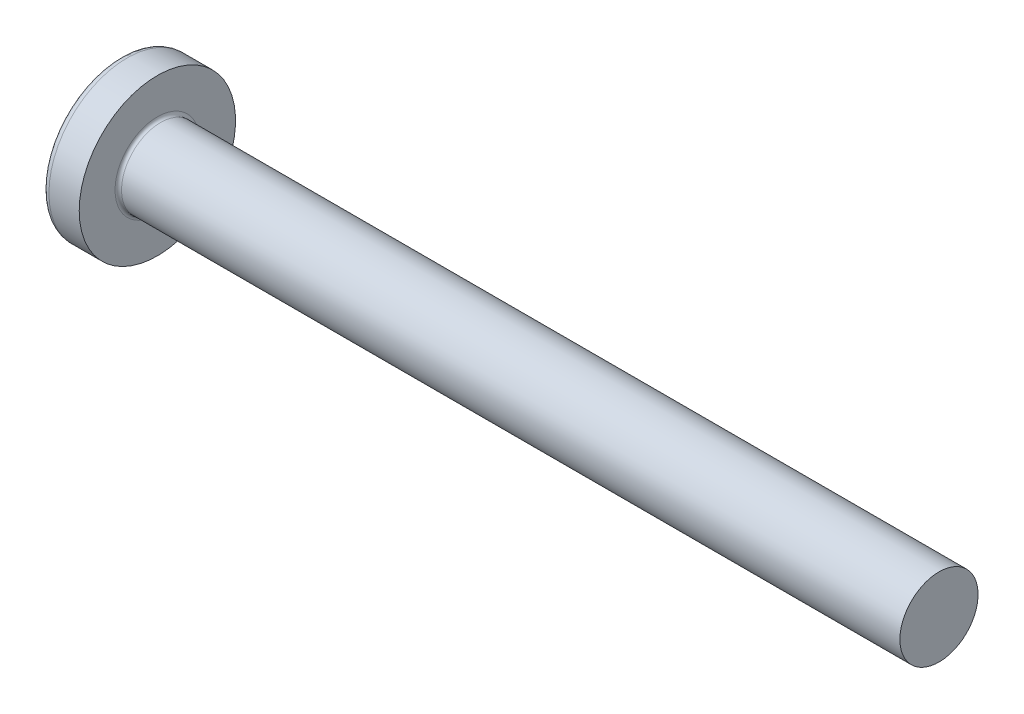
ISO-10303-21;
HEADER;
FILE_DESCRIPTION(('STEP AP214'),'2;1');
FILE_NAME('part.step','',(''),(''),'','','');
FILE_SCHEMA(('AUTOMOTIVE_DESIGN { 1 0 10303 214 1 1 1 1 }'));
ENDSEC;
DATA;
#1=APPLICATION_CONTEXT('core data for automotive mechanical design processes');
#2=APPLICATION_PROTOCOL_DEFINITION('international standard','automotive_design',2000,#1);
#3=PRODUCT_CONTEXT('',#1,'mechanical');
#4=PRODUCT('Part','Part','',(#3));
#5=PRODUCT_RELATED_PRODUCT_CATEGORY('part','',(#4));
#6=PRODUCT_DEFINITION_FORMATION('','',#4);
#7=PRODUCT_DEFINITION_CONTEXT('part definition',#1,'design');
#8=PRODUCT_DEFINITION('design','',#6,#7);
#9=PRODUCT_DEFINITION_SHAPE('','',#8);
#10=(LENGTH_UNIT() NAMED_UNIT(*) SI_UNIT(.MILLI.,.METRE.));
#11=(NAMED_UNIT(*) PLANE_ANGLE_UNIT() SI_UNIT($,.RADIAN.));
#12=(NAMED_UNIT(*) SI_UNIT($,.STERADIAN.) SOLID_ANGLE_UNIT());
#13=UNCERTAINTY_MEASURE_WITH_UNIT(LENGTH_MEASURE(1.E-05),#10,'distance_accuracy_value','');
#14=(GEOMETRIC_REPRESENTATION_CONTEXT(3) GLOBAL_UNCERTAINTY_ASSIGNED_CONTEXT((#13)) GLOBAL_UNIT_ASSIGNED_CONTEXT((#10,
#11,#12)) REPRESENTATION_CONTEXT('',''));
#15=CARTESIAN_POINT('',(0.,0.,0.));
#16=DIRECTION('',(0.,0.,1.));
#17=DIRECTION('',(1.,0.,0.));
#18=AXIS2_PLACEMENT_3D('',#15,#16,#17);
#19=CARTESIAN_POINT('',(10.,0.,0.));
#20=DIRECTION('',(-1.,0.,0.));
#21=DIRECTION('',(0.,1.,0.));
#22=AXIS2_PLACEMENT_3D('',#19,#20,#21);
#23=SPHERICAL_SURFACE('',#22,10.);
#24=CARTESIAN_POINT('',(1.83373872480847,0.,0.));
#25=DIRECTION('',(-1.,0.,0.));
#26=DIRECTION('',(0.,0.,1.));
#27=AXIS2_PLACEMENT_3D('',#24,#25,#26);
#28=CIRCLE('',#27,5.77167019027484);
#29=CARTESIAN_POINT('',(1.83373872480847,0.,5.77167019027484));
#30=VERTEX_POINT('',#29);
#31=EDGE_CURVE('E213',#30,#30,#28,.T.);
#32=ORIENTED_EDGE('',*,*,#31,.T.);
#33=EDGE_LOOP('',(#32));
#34=FACE_BOUND('',#33,.T.);
#35=CARTESIAN_POINT('',(0.11533271177369,0.,0.));
#36=DIRECTION('',(1.,0.,0.));
#37=DIRECTION('',(0.,0.,-1.));
#38=AXIS2_PLACEMENT_3D('',#35,#36,#37);
#39=CIRCLE('',#38,1.51438192047739);
#40=CARTESIAN_POINT('',(0.115332711773695,-0.709999999999995,-1.33762947076864));
#41=VERTEX_POINT('',#40);
#42=CARTESIAN_POINT('',(0.11533271177369,-1.33762947076862,-0.71));
#43=VERTEX_POINT('',#42);
#44=EDGE_CURVE('E339',#41,#43,#39,.F.);
#45=ORIENTED_EDGE('',*,*,#44,.F.);
#46=CARTESIAN_POINT('',(10.,-0.71,0.));
#47=DIRECTION('',(0.,1.,0.));
#48=DIRECTION('',(0.,0.,1.));
#49=AXIS2_PLACEMENT_3D('',#46,#47,#48);
#50=CIRCLE('',#49,9.97476315508293);
#51=CARTESIAN_POINT('',(0.516695966128057,-0.709999999999988,-3.09238493741451));
#52=VERTEX_POINT('',#51);
#53=EDGE_CURVE('E273',#52,#41,#50,.T.);
#54=ORIENTED_EDGE('',*,*,#53,.F.);
#55=CARTESIAN_POINT('',(9.3467899937754,0.,1.3101368059126));
#56=DIRECTION('',(0.446197753347436,0.,-0.894934391398443));
#57=DIRECTION('',(-0.894934391398442,0.,-0.446197753347436));
#58=AXIS2_PLACEMENT_3D('',#55,#56,#57);
#59=CIRCLE('',#58,9.89226254390578);
#60=CARTESIAN_POINT('',(0.516695966128057,0.710000000000011,-3.0923849374145));
#61=VERTEX_POINT('',#60);
#62=EDGE_CURVE('E247',#52,#61,#59,.T.);
#63=ORIENTED_EDGE('',*,*,#62,.T.);
#64=CARTESIAN_POINT('',(10.,0.71,0.));
#65=DIRECTION('',(0.,-1.,0.));
#66=DIRECTION('',(0.,0.,-1.));
#67=AXIS2_PLACEMENT_3D('',#64,#65,#66);
#68=CIRCLE('',#67,9.97476315508293);
#69=CARTESIAN_POINT('',(0.115332711773694,0.710000000000005,-1.33762947076863));
#70=VERTEX_POINT('',#69);
#71=EDGE_CURVE('E301',#70,#61,#68,.T.);
#72=ORIENTED_EDGE('',*,*,#71,.F.);
#73=CARTESIAN_POINT('',(0.11533271177369,1.33762947076862,-0.71));
#74=VERTEX_POINT('',#73);
#75=EDGE_CURVE('E354',#74,#70,#39,.F.);
#76=ORIENTED_EDGE('',*,*,#75,.F.);
#77=CARTESIAN_POINT('',(10.,0.,-0.71));
#78=DIRECTION('',(0.,0.,1.));
#79=DIRECTION('',(0.,-1.,0.));
#80=AXIS2_PLACEMENT_3D('',#77,#78,#79);
#81=CIRCLE('',#80,9.97476315508293);
#82=CARTESIAN_POINT('',(0.516695966128057,3.09238493741451,-0.71));
#83=VERTEX_POINT('',#82);
#84=EDGE_CURVE('E241',#83,#74,#81,.T.);
#85=ORIENTED_EDGE('',*,*,#84,.F.);
#86=CARTESIAN_POINT('',(9.3467899937754,-1.3101368059126,0.));
#87=DIRECTION('',(0.446197753347436,0.894934391398443,0.));
#88=DIRECTION('',(-0.894934391398443,0.446197753347436,0.));
#89=AXIS2_PLACEMENT_3D('',#86,#87,#88);
#90=CIRCLE('',#89,9.89226254390578);
#91=CARTESIAN_POINT('',(0.516695966128057,3.09238493741451,0.71));
#92=VERTEX_POINT('',#91);
#93=EDGE_CURVE('E244',#83,#92,#90,.T.);
#94=ORIENTED_EDGE('',*,*,#93,.T.);
#95=CARTESIAN_POINT('',(10.,0.,0.71));
#96=DIRECTION('',(0.,0.,-1.));
#97=DIRECTION('',(0.,1.,0.));
#98=AXIS2_PLACEMENT_3D('',#95,#96,#97);
#99=CIRCLE('',#98,9.97476315508293);
#100=CARTESIAN_POINT('',(0.11533271177369,1.33762947076862,0.71));
#101=VERTEX_POINT('',#100);
#102=EDGE_CURVE('E237',#101,#92,#99,.T.);
#103=ORIENTED_EDGE('',*,*,#102,.F.);
#104=CARTESIAN_POINT('',(0.115332711773695,0.709999999999995,1.33762947076864));
#105=VERTEX_POINT('',#104);
#106=EDGE_CURVE('E353',#105,#101,#39,.F.);
#107=ORIENTED_EDGE('',*,*,#106,.F.);
#108=CARTESIAN_POINT('',(0.516695966128057,0.709999999999989,3.09238493741451));
#109=VERTEX_POINT('',#108);
#110=EDGE_CURVE('E257',#109,#105,#68,.T.);
#111=ORIENTED_EDGE('',*,*,#110,.F.);
#112=CARTESIAN_POINT('',(9.3467899937754,0.,-1.3101368059126));
#113=DIRECTION('',(0.446197753347436,0.,0.894934391398443));
#114=DIRECTION('',(0.894934391398443,0.,-0.446197753347436));
#115=AXIS2_PLACEMENT_3D('',#112,#113,#114);
#116=CIRCLE('',#115,9.89226254390578);
#117=CARTESIAN_POINT('',(0.516695966128057,-0.710000000000011,3.0923849374145));
#118=VERTEX_POINT('',#117);
#119=EDGE_CURVE('E48',#109,#118,#116,.T.);
#120=ORIENTED_EDGE('',*,*,#119,.T.);
#121=CARTESIAN_POINT('',(0.115332711773695,-0.710000000000005,1.33762947076863));
#122=VERTEX_POINT('',#121);
#123=EDGE_CURVE('E254',#122,#118,#50,.T.);
#124=ORIENTED_EDGE('',*,*,#123,.F.);
#125=CARTESIAN_POINT('',(0.11533271177369,-1.33762947076862,0.709999999999999));
#126=VERTEX_POINT('',#125);
#127=EDGE_CURVE('E385',#126,#122,#39,.F.);
#128=ORIENTED_EDGE('',*,*,#127,.F.);
#129=CARTESIAN_POINT('',(0.516695966128057,-3.0923849374145,0.709999999999999));
#130=VERTEX_POINT('',#129);
#131=EDGE_CURVE('E238',#130,#126,#99,.T.);
#132=ORIENTED_EDGE('',*,*,#131,.F.);
#133=CARTESIAN_POINT('',(9.3467899937754,1.3101368059126,0.));
#134=DIRECTION('',(0.446197753347436,-0.894934391398443,0.));
#135=DIRECTION('',(0.894934391398442,0.446197753347436,0.));
#136=AXIS2_PLACEMENT_3D('',#133,#134,#135);
#137=CIRCLE('',#136,9.89226254390578);
#138=CARTESIAN_POINT('',(0.516695966128057,-3.0923849374145,-0.71));
#139=VERTEX_POINT('',#138);
#140=EDGE_CURVE('E234',#130,#139,#137,.T.);
#141=ORIENTED_EDGE('',*,*,#140,.T.);
#142=EDGE_CURVE('E63',#43,#139,#81,.T.);
#143=ORIENTED_EDGE('',*,*,#142,.F.);
#144=EDGE_LOOP('',(#45,#54,#63,#72,#76,#85,#94,#103,#107,#111,#120,#124,#128,#132,#141,#143));
#145=FACE_BOUND('',#144,.T.);
#146=ADVANCED_FACE('F35',(#34,#145),#23,.T.);
#147=CARTESIAN_POINT('',(3.46,1.62490792462486,-0.71));
#148=DIRECTION('',(0.,0.,1.));
#149=DIRECTION('',(0.,-1.,0.));
#150=AXIS2_PLACEMENT_3D('',#147,#148,#149);
#151=PLANE('',#150);
#152=ORIENTED_EDGE('',*,*,#84,.T.);
#153=CARTESIAN_POINT('',(-2.28089704213722,1.52473965101837,-0.71));
#154=CARTESIAN_POINT('',(-1.81861622822998,1.48907386498352,-0.71));
#155=CARTESIAN_POINT('',(-1.35635131302274,1.45320000395987,-0.71));
#156=CARTESIAN_POINT('',(-0.431857761667543,1.3808964085712,-0.71));
#157=CARTESIAN_POINT('',(0.0303708738054363,1.34446666558133,-0.71));
#158=CARTESIAN_POINT('',(0.954772750089382,1.27091270389059,-0.71));
#159=CARTESIAN_POINT('',(1.41694599093296,1.23378848560061,-0.71));
#160=CARTESIAN_POINT('',(2.1101468655661,1.17741958304234,-0.71));
#161=CARTESIAN_POINT('',(2.34120225142472,1.15851633138213,-0.71));
#162=CARTESIAN_POINT('',(2.80329254149198,1.12044387603508,-0.71));
#163=CARTESIAN_POINT('',(3.03432744556048,1.10127467065167,-0.71));
#164=CARTESIAN_POINT('',(3.81376951672291,1.03608826026628,-0.71));
#165=CARTESIAN_POINT('',(4.3621185642133,0.989367924506424,-0.71));
#166=CARTESIAN_POINT('',(5.18446393534975,0.917336183170652,-0.71));
#167=CARTESIAN_POINT('',(5.45854573527601,0.893000731200899,-0.71));
#168=CARTESIAN_POINT('',(6.00663594033703,0.843493254998865,-0.71));
#169=CARTESIAN_POINT('',(6.28064434495887,0.818321225066341,-0.71));
#170=CARTESIAN_POINT('',(6.82859287274618,0.766879824151132,-0.71));
#171=CARTESIAN_POINT('',(7.10253298312854,0.740610316661091,-0.71));
#172=CARTESIAN_POINT('',(7.65026285025565,0.686585019837831,-0.71));
#173=CARTESIAN_POINT('',(7.92405260972714,0.658829258423122,-0.71));
#174=CARTESIAN_POINT('',(8.33458184018721,0.615573696383426,-0.71));
#175=CARTESIAN_POINT('',(8.4714065534312,0.600884001267348,-0.71));
#176=CARTESIAN_POINT('',(8.74498055470476,0.570826220799602,-0.71));
#177=CARTESIAN_POINT('',(8.88172984329827,0.555458140591717,-0.71));
#178=CARTESIAN_POINT('',(9.15513948220117,0.523868434617907,-0.71));
#179=CARTESIAN_POINT('',(9.29179982631774,0.507646754763106,-0.71));
#180=CARTESIAN_POINT('',(9.56498051884117,0.474039680066355,-0.71));
#181=CARTESIAN_POINT('',(9.70150086350508,0.456654254894289,-0.71));
#182=CARTESIAN_POINT('',(9.83792645731126,0.438531836217976,-0.71));
#183=B_SPLINE_CURVE_WITH_KNOTS('',3,(#153,#154,#155,#156,#157,#158,#159,#160,#161,#162,#163,
#164,#165,#166,#167,#168,#169,#170,#171,#172,#173,#174,#175,#176,#177,#178,#179,#180,#181,#182),
.UNSPECIFIED.,.F.,.F.,(4,2,2,2,2,2,2,2,2,2,2,2,2,2,4),(0.,1.39096401174475,2.78194962715189,
4.17293441960638,4.86841633218882,5.56390268344286,7.21490482310267,8.04038405799492,
8.86586891866053,9.69145676295231,10.5170291044415,10.9298607906012,11.3426893470464,
11.7555440942062,12.1684096055867),.UNSPECIFIED.);
#184=CARTESIAN_POINT('',(3.46,1.06563607765503,-0.710000000000001));
#185=VERTEX_POINT('',#184);
#186=EDGE_CURVE('E374',#74,#185,#183,.T.);
#187=ORIENTED_EDGE('',*,*,#186,.T.);
#188=DIRECTION('',(0.,1.,0.));
#189=VECTOR('',#188,1.);
#190=CARTESIAN_POINT('',(3.46,-1.62490792462486,-0.71));
#191=LINE('',#190,#189);
#192=CARTESIAN_POINT('',(3.46,1.62490792462486,-0.71));
#193=VERTEX_POINT('',#192);
#194=EDGE_CURVE('E322',#185,#193,#191,.T.);
#195=ORIENTED_EDGE('',*,*,#194,.T.);
#196=DIRECTION('',(0.894934391398442,-0.446197753347436,0.));
#197=VECTOR('',#196,1.);
#198=CARTESIAN_POINT('',(0.,3.35,-0.71));
#199=LINE('',#198,#197);
#200=EDGE_CURVE('E214',#83,#193,#199,.T.);
#201=ORIENTED_EDGE('',*,*,#200,.F.);
#202=EDGE_LOOP('',(#152,#187,#195,#201));
#203=FACE_BOUND('',#202,.T.);
#204=ADVANCED_FACE('F169',(#203),#151,.T.);
#205=CARTESIAN_POINT('',(3.46,-1.62490792462486,-0.71));
#206=VERTEX_POINT('',#205);
#207=CARTESIAN_POINT('',(3.46,-1.06563607765503,-0.710000000000001));
#208=VERTEX_POINT('',#207);
#209=EDGE_CURVE('E222',#206,#208,#191,.T.);
#210=ORIENTED_EDGE('',*,*,#209,.T.);
#211=CARTESIAN_POINT('',(-2.28089705027091,-1.52473965164577,-0.71));
#212=CARTESIAN_POINT('',(-1.81861623532717,-1.48907386553353,-0.71));
#213=CARTESIAN_POINT('',(-1.35635131908348,-1.45320000443187,-0.71));
#214=CARTESIAN_POINT('',(-0.431857765655443,-1.38089640888514,-0.71));
#215=CARTESIAN_POINT('',(0.0303708708539244,-1.3444666658152,-0.71));
#216=CARTESIAN_POINT('',(0.954772749881989,-1.27091270390807,-0.71));
#217=CARTESIAN_POINT('',(1.41694599243322,-1.23378848548075,-0.71));
#218=CARTESIAN_POINT('',(2.11014686962733,-1.17741958271103,-0.71));
#219=CARTESIAN_POINT('',(2.3412022563395,-1.15851633097942,-0.71));
#220=CARTESIAN_POINT('',(2.80329254811369,-1.12044387548729,-0.71));
#221=CARTESIAN_POINT('',(3.03432745303557,-1.10127467003019,-0.71));
#222=CARTESIAN_POINT('',(3.81376952505089,-1.03608825956087,-0.71));
#223=CARTESIAN_POINT('',(4.36211857254078,-0.989367923790553,-0.71));
#224=CARTESIAN_POINT('',(5.18446394367596,-0.917336182434635,-0.71));
#225=CARTESIAN_POINT('',(5.45854574360167,-0.893000730457428,-0.71));
#226=CARTESIAN_POINT('',(6.00663594866142,-0.843493254238335,-0.71));
#227=CARTESIAN_POINT('',(6.28064435328252,-0.818321224296205,-0.71));
#228=CARTESIAN_POINT('',(6.82859288106826,-0.766879823358567,-0.71));
#229=CARTESIAN_POINT('',(7.1025329914498,-0.7406103158557,-0.71));
#230=CARTESIAN_POINT('',(7.65026285857465,-0.686585019001786,-0.71));
#231=CARTESIAN_POINT('',(7.92405261804469,-0.658829257569248,-0.71));
#232=CARTESIAN_POINT('',(8.3345818485019,-0.615573695496181,-0.71));
#233=CARTESIAN_POINT('',(8.47140656174489,-0.600884000367865,-0.71));
#234=CARTESIAN_POINT('',(8.74498056301602,-0.570826219872503,-0.71));
#235=CARTESIAN_POINT('',(8.8817298516081,-0.555458139649238,-0.71));
#236=CARTESIAN_POINT('',(9.15513949050764,-0.523868433640255,-0.71));
#237=CARTESIAN_POINT('',(9.29179983462227,-0.50764675376566,-0.71));
#238=CARTESIAN_POINT('',(9.56498052714077,-0.474039679022048,-0.71));
#239=CARTESIAN_POINT('',(9.70150087180168,-0.456654253822914,-0.71));
#240=CARTESIAN_POINT('',(9.83792646560407,-0.438531835114465,-0.71));
#241=B_SPLINE_CURVE_WITH_KNOTS('',3,(#211,#212,#213,#214,#215,#216,#217,#218,#219,#220,#221,
#222,#223,#224,#225,#226,#227,#228,#229,#230,#231,#232,#233,#234,#235,#236,#237,#238,#239,#240),
.UNSPECIFIED.,.F.,.F.,(4,2,2,2,2,2,2,2,2,2,2,2,2,2,4),(0.,1.39096401486289,2.78194963338846,
4.17293443098243,4.86841634613445,5.56390269995814,7.21490483961907,8.04038407451168,
8.8658689351777,9.69145677947068,10.5170291209609,10.9298608071215,11.3426893635676,
11.7555441107285,12.1684096221104),.UNSPECIFIED.);
#242=EDGE_CURVE('E352',#208,#43,#241,.F.);
#243=ORIENTED_EDGE('',*,*,#242,.T.);
#244=ORIENTED_EDGE('',*,*,#142,.T.);
#245=DIRECTION('',(0.894934391398442,0.446197753347436,0.));
#246=VECTOR('',#245,1.);
#247=CARTESIAN_POINT('',(0.,-3.35,-0.71));
#248=LINE('',#247,#246);
#249=EDGE_CURVE('E304',#139,#206,#248,.T.);
#250=ORIENTED_EDGE('',*,*,#249,.T.);
#251=EDGE_LOOP('',(#210,#243,#244,#250));
#252=FACE_BOUND('',#251,.T.);
#253=ADVANCED_FACE('F175',(#252),#151,.T.);
#254=CARTESIAN_POINT('',(3.46,-1.62490792462486,0.71));
#255=DIRECTION('',(0.,0.,-1.));
#256=DIRECTION('',(0.,1.,0.));
#257=AXIS2_PLACEMENT_3D('',#254,#255,#256);
#258=PLANE('',#257);
#259=DIRECTION('',(0.,-1.,0.));
#260=VECTOR('',#259,1.);
#261=CARTESIAN_POINT('',(3.46,1.62490792462486,0.71));
#262=LINE('',#261,#260);
#263=CARTESIAN_POINT('',(3.46,1.62490792462486,0.71));
#264=VERTEX_POINT('',#263);
#265=CARTESIAN_POINT('',(3.46,1.06563607765503,0.710000000000001));
#266=VERTEX_POINT('',#265);
#267=EDGE_CURVE('E312',#264,#266,#262,.T.);
#268=ORIENTED_EDGE('',*,*,#267,.T.);
#269=CARTESIAN_POINT('',(-2.28089704213722,1.52473965101837,0.71));
#270=CARTESIAN_POINT('',(-1.81861622822998,1.48907386498352,0.71));
#271=CARTESIAN_POINT('',(-1.35635131302274,1.45320000395987,0.71));
#272=CARTESIAN_POINT('',(-0.431857761667543,1.3808964085712,0.71));
#273=CARTESIAN_POINT('',(0.0303708738054364,1.34446666558133,0.71));
#274=CARTESIAN_POINT('',(0.954772750089383,1.27091270389059,0.71));
#275=CARTESIAN_POINT('',(1.41694599093296,1.23378848560061,0.71));
#276=CARTESIAN_POINT('',(2.1101468655661,1.17741958304234,0.71));
#277=CARTESIAN_POINT('',(2.34120225142472,1.15851633138213,0.71));
#278=CARTESIAN_POINT('',(2.80329254149198,1.12044387603508,0.71));
#279=CARTESIAN_POINT('',(3.03432744556048,1.10127467065167,0.71));
#280=CARTESIAN_POINT('',(3.81376951672291,1.03608826026628,0.71));
#281=CARTESIAN_POINT('',(4.3621185642133,0.989367924506424,0.71));
#282=CARTESIAN_POINT('',(5.18446393534975,0.917336183170652,0.71));
#283=CARTESIAN_POINT('',(5.45854573527601,0.893000731200899,0.71));
#284=CARTESIAN_POINT('',(6.00663594033703,0.843493254998865,0.71));
#285=CARTESIAN_POINT('',(6.28064434495887,0.818321225066341,0.71));
#286=CARTESIAN_POINT('',(6.82859287274618,0.766879824151132,0.71));
#287=CARTESIAN_POINT('',(7.10253298312854,0.74061031666109,0.71));
#288=CARTESIAN_POINT('',(7.65026285025565,0.686585019837831,0.71));
#289=CARTESIAN_POINT('',(7.92405260972714,0.658829258423122,0.71));
#290=CARTESIAN_POINT('',(8.33458184018721,0.615573696383426,0.71));
#291=CARTESIAN_POINT('',(8.4714065534312,0.600884001267348,0.71));
#292=CARTESIAN_POINT('',(8.74498055470475,0.570826220799602,0.71));
#293=CARTESIAN_POINT('',(8.88172984329826,0.555458140591717,0.71));
#294=CARTESIAN_POINT('',(9.15513948220117,0.523868434617907,0.71));
#295=CARTESIAN_POINT('',(9.29179982631774,0.507646754763106,0.71));
#296=CARTESIAN_POINT('',(9.56498051884117,0.474039680066355,0.71));
#297=CARTESIAN_POINT('',(9.70150086350508,0.456654254894289,0.71));
#298=CARTESIAN_POINT('',(9.83792645731126,0.438531836217976,0.71));
#299=B_SPLINE_CURVE_WITH_KNOTS('',3,(#269,#270,#271,#272,#273,#274,#275,#276,#277,#278,#279,
#280,#281,#282,#283,#284,#285,#286,#287,#288,#289,#290,#291,#292,#293,#294,#295,#296,#297,#298),
.UNSPECIFIED.,.F.,.F.,(4,2,2,2,2,2,2,2,2,2,2,2,2,2,4),(0.,1.39096401174475,2.78194962715189,
4.17293441960638,4.86841633218882,5.56390268344286,7.21490482310267,8.04038405799492,
8.86586891866053,9.69145676295231,10.5170291044415,10.9298607906012,11.3426893470464,
11.7555440942062,12.1684096055867),.UNSPECIFIED.);
#300=EDGE_CURVE('E278',#266,#101,#299,.F.);
#301=ORIENTED_EDGE('',*,*,#300,.T.);
#302=ORIENTED_EDGE('',*,*,#102,.T.);
#303=DIRECTION('',(0.894934391398442,-0.446197753347436,0.));
#304=VECTOR('',#303,1.);
#305=CARTESIAN_POINT('',(0.,3.35,0.71));
#306=LINE('',#305,#304);
#307=EDGE_CURVE('E219',#92,#264,#306,.T.);
#308=ORIENTED_EDGE('',*,*,#307,.T.);
#309=EDGE_LOOP('',(#268,#301,#302,#308));
#310=FACE_BOUND('',#309,.T.);
#311=ADVANCED_FACE('F370',(#310),#258,.T.);
#312=ORIENTED_EDGE('',*,*,#131,.T.);
#313=CARTESIAN_POINT('',(-2.28089705027091,-1.52473965164577,0.709999999999999));
#314=CARTESIAN_POINT('',(-1.81861623532717,-1.48907386553353,0.709999999999999));
#315=CARTESIAN_POINT('',(-1.35635131908348,-1.45320000443187,0.709999999999999));
#316=CARTESIAN_POINT('',(-0.431857765655443,-1.38089640888514,0.709999999999999));
#317=CARTESIAN_POINT('',(0.030370870853924,-1.3444666658152,0.71));
#318=CARTESIAN_POINT('',(0.954772749881989,-1.27091270390807,0.71));
#319=CARTESIAN_POINT('',(1.41694599243322,-1.23378848548075,0.71));
#320=CARTESIAN_POINT('',(2.11014686962733,-1.17741958271103,0.71));
#321=CARTESIAN_POINT('',(2.3412022563395,-1.15851633097942,0.71));
#322=CARTESIAN_POINT('',(2.80329254811369,-1.12044387548729,0.71));
#323=CARTESIAN_POINT('',(3.03432745303557,-1.10127467003019,0.71));
#324=CARTESIAN_POINT('',(3.81376952505089,-1.03608825956087,0.71));
#325=CARTESIAN_POINT('',(4.36211857254078,-0.989367923790553,0.71));
#326=CARTESIAN_POINT('',(5.18446394367596,-0.917336182434635,0.71));
#327=CARTESIAN_POINT('',(5.45854574360167,-0.893000730457428,0.71));
#328=CARTESIAN_POINT('',(6.00663594866141,-0.843493254238335,0.71));
#329=CARTESIAN_POINT('',(6.28064435328252,-0.818321224296205,0.71));
#330=CARTESIAN_POINT('',(6.82859288106826,-0.766879823358567,0.71));
#331=CARTESIAN_POINT('',(7.1025329914498,-0.740610315855701,0.71));
#332=CARTESIAN_POINT('',(7.65026285857464,-0.686585019001787,0.71));
#333=CARTESIAN_POINT('',(7.92405261804469,-0.658829257569249,0.71));
#334=CARTESIAN_POINT('',(8.33458184850189,-0.615573695496181,0.71));
#335=CARTESIAN_POINT('',(8.47140656174489,-0.600884000367866,0.71));
#336=CARTESIAN_POINT('',(8.74498056301602,-0.570826219872503,0.71));
#337=CARTESIAN_POINT('',(8.8817298516081,-0.555458139649238,0.71));
#338=CARTESIAN_POINT('',(9.15513949050764,-0.523868433640256,0.71));
#339=CARTESIAN_POINT('',(9.29179983462226,-0.507646753765661,0.71));
#340=CARTESIAN_POINT('',(9.56498052714076,-0.474039679022049,0.71));
#341=CARTESIAN_POINT('',(9.70150087180168,-0.456654253822915,0.71));
#342=CARTESIAN_POINT('',(9.83792646560406,-0.438531835114466,0.71));
#343=B_SPLINE_CURVE_WITH_KNOTS('',3,(#313,#314,#315,#316,#317,#318,#319,#320,#321,#322,#323,
#324,#325,#326,#327,#328,#329,#330,#331,#332,#333,#334,#335,#336,#337,#338,#339,#340,#341,#342),
.UNSPECIFIED.,.F.,.F.,(4,2,2,2,2,2,2,2,2,2,2,2,2,2,4),(0.,1.39096401486289,2.78194963338846,
4.17293443098243,4.86841634613445,5.56390269995814,7.21490483961907,8.04038407451168,
8.8658689351777,9.69145677947067,10.5170291209609,10.9298608071215,11.3426893635676,
11.7555441107285,12.1684096221104),.UNSPECIFIED.);
#344=CARTESIAN_POINT('',(3.46,-1.06563607765503,0.710000000000001));
#345=VERTEX_POINT('',#344);
#346=EDGE_CURVE('E386',#126,#345,#343,.T.);
#347=ORIENTED_EDGE('',*,*,#346,.T.);
#348=CARTESIAN_POINT('',(3.46,-1.62490792462486,0.71));
#349=VERTEX_POINT('',#348);
#350=EDGE_CURVE('E314',#345,#349,#262,.T.);
#351=ORIENTED_EDGE('',*,*,#350,.T.);
#352=DIRECTION('',(0.894934391398442,0.446197753347436,0.));
#353=VECTOR('',#352,1.);
#354=CARTESIAN_POINT('',(0.,-3.35,0.709999999999999));
#355=LINE('',#354,#353);
#356=EDGE_CURVE('E306',#130,#349,#355,.T.);
#357=ORIENTED_EDGE('',*,*,#356,.F.);
#358=EDGE_LOOP('',(#312,#347,#351,#357));
#359=FACE_BOUND('',#358,.T.);
#360=ADVANCED_FACE('F415',(#359),#258,.T.);
#361=CARTESIAN_POINT('',(3.46,1.62490792462486,-0.71));
#362=DIRECTION('',(-1.,0.,0.));
#363=DIRECTION('',(0.,0.,1.));
#364=AXIS2_PLACEMENT_3D('',#361,#362,#363);
#365=PLANE('',#364);
#366=ORIENTED_EDGE('',*,*,#350,.F.);
#367=CARTESIAN_POINT('',(3.46,0.,0.));
#368=DIRECTION('',(-1.,0.,0.));
#369=DIRECTION('',(0.,0.,1.));
#370=AXIS2_PLACEMENT_3D('',#367,#368,#369);
#371=CIRCLE('',#370,1.2805);
#372=EDGE_CURVE('E347',#208,#345,#371,.T.);
#373=ORIENTED_EDGE('',*,*,#372,.F.);
#374=ORIENTED_EDGE('',*,*,#209,.F.);
#375=DIRECTION('',(0.,0.,1.));
#376=VECTOR('',#375,1.);
#377=CARTESIAN_POINT('',(3.46,-1.62490792462486,-0.71));
#378=LINE('',#377,#376);
#379=EDGE_CURVE('E309',#206,#349,#378,.T.);
#380=ORIENTED_EDGE('',*,*,#379,.T.);
#381=EDGE_LOOP('',(#366,#373,#374,#380));
#382=FACE_BOUND('',#381,.T.);
#383=ADVANCED_FACE('F408',(#382),#365,.T.);
#384=DIRECTION('',(0.,0.,-1.));
#385=VECTOR('',#384,1.);
#386=CARTESIAN_POINT('',(3.46,-0.710000000000006,1.62490792462486));
#387=LINE('',#386,#385);
#388=CARTESIAN_POINT('',(3.46,-0.709999999999996,-1.06563607765503));
#389=VERTEX_POINT('',#388);
#390=CARTESIAN_POINT('',(3.46,-0.709999999999994,-1.62490792462486));
#391=VERTEX_POINT('',#390);
#392=EDGE_CURVE('E295',#389,#391,#387,.T.);
#393=ORIENTED_EDGE('',*,*,#392,.F.);
#394=CARTESIAN_POINT('',(3.46,0.710000000000004,-1.06563607765503));
#395=VERTEX_POINT('',#394);
#396=EDGE_CURVE('E55',#395,#389,#371,.T.);
#397=ORIENTED_EDGE('',*,*,#396,.F.);
#398=DIRECTION('',(0.,0.,1.));
#399=VECTOR('',#398,1.);
#400=CARTESIAN_POINT('',(3.46,0.710000000000006,-1.62490792462486));
#401=LINE('',#400,#399);
#402=CARTESIAN_POINT('',(3.46,0.710000000000006,-1.62490792462486));
#403=VERTEX_POINT('',#402);
#404=EDGE_CURVE('E298',#403,#395,#401,.T.);
#405=ORIENTED_EDGE('',*,*,#404,.F.);
#406=DIRECTION('',(0.,-1.,0.));
#407=VECTOR('',#406,1.);
#408=CARTESIAN_POINT('',(3.46,0.710000000000006,-1.62490792462486));
#409=LINE('',#408,#407);
#410=EDGE_CURVE('E289',#403,#391,#409,.T.);
#411=ORIENTED_EDGE('',*,*,#410,.T.);
#412=EDGE_LOOP('',(#393,#397,#405,#411));
#413=FACE_BOUND('',#412,.T.);
#414=ADVANCED_FACE('F342',(#413),#365,.T.);
#415=ORIENTED_EDGE('',*,*,#194,.F.);
#416=EDGE_CURVE('E346',#266,#185,#371,.T.);
#417=ORIENTED_EDGE('',*,*,#416,.F.);
#418=ORIENTED_EDGE('',*,*,#267,.F.);
#419=DIRECTION('',(0.,0.,-1.));
#420=VECTOR('',#419,1.);
#421=CARTESIAN_POINT('',(3.46,1.62490792462486,0.71));
#422=LINE('',#421,#420);
#423=EDGE_CURVE('E315',#264,#193,#422,.T.);
#424=ORIENTED_EDGE('',*,*,#423,.T.);
#425=EDGE_LOOP('',(#415,#417,#418,#424));
#426=FACE_BOUND('',#425,.T.);
#427=ADVANCED_FACE('F409',(#426),#365,.T.);
#428=CARTESIAN_POINT('',(3.46,0.709999999999994,1.62490792462486));
#429=DIRECTION('',(0.,-1.,0.));
#430=DIRECTION('',(0.,0.,-1.));
#431=AXIS2_PLACEMENT_3D('',#428,#429,#430);
#432=PLANE('',#431);
#433=ORIENTED_EDGE('',*,*,#110,.T.);
#434=CARTESIAN_POINT('',(-2.28089705027091,0.709999999999995,1.52473965164577));
#435=CARTESIAN_POINT('',(-1.81861623532717,0.709999999999995,1.48907386553354));
#436=CARTESIAN_POINT('',(-1.35635131908348,0.709999999999995,1.45320000443187));
#437=CARTESIAN_POINT('',(-0.431857765655442,0.709999999999995,1.38089640888514));
#438=CARTESIAN_POINT('',(0.0303708708539246,0.709999999999995,1.34446666581521));
#439=CARTESIAN_POINT('',(0.954772749881989,0.709999999999996,1.27091270390808));
#440=CARTESIAN_POINT('',(1.41694599243322,0.709999999999996,1.23378848548076));
#441=CARTESIAN_POINT('',(2.11014686962733,0.709999999999996,1.17741958271103));
#442=CARTESIAN_POINT('',(2.3412022563395,0.709999999999996,1.15851633097942));
#443=CARTESIAN_POINT('',(2.80329254811369,0.709999999999996,1.12044387548729));
#444=CARTESIAN_POINT('',(3.03432745303557,0.709999999999996,1.1012746700302));
#445=CARTESIAN_POINT('',(3.81376952505089,0.709999999999996,1.03608825956087));
#446=CARTESIAN_POINT('',(4.36211857254078,0.709999999999997,0.989367923790556));
#447=CARTESIAN_POINT('',(5.18446394367596,0.709999999999997,0.917336182434638));
#448=CARTESIAN_POINT('',(5.45854574360167,0.709999999999997,0.89300073045743));
#449=CARTESIAN_POINT('',(6.00663594866141,0.709999999999997,0.843493254238337));
#450=CARTESIAN_POINT('',(6.28064435328252,0.709999999999997,0.818321224296208));
#451=CARTESIAN_POINT('',(6.82859288106826,0.709999999999997,0.766879823358569));
#452=CARTESIAN_POINT('',(7.1025329914498,0.709999999999998,0.740610315855702));
#453=CARTESIAN_POINT('',(7.65026285857464,0.709999999999998,0.686585019001789));
#454=CARTESIAN_POINT('',(7.92405261804469,0.709999999999998,0.658829257569251));
#455=CARTESIAN_POINT('',(8.3345818485019,0.709999999999998,0.615573695496184));
#456=CARTESIAN_POINT('',(8.47140656174489,0.709999999999998,0.600884000367868));
#457=CARTESIAN_POINT('',(8.74498056301602,0.709999999999998,0.570826219872505));
#458=CARTESIAN_POINT('',(8.8817298516081,0.709999999999998,0.555458139649241));
#459=CARTESIAN_POINT('',(9.15513949050764,0.709999999999998,0.523868433640258));
#460=CARTESIAN_POINT('',(9.29179983462226,0.709999999999998,0.507646753765663));
#461=CARTESIAN_POINT('',(9.56498052714076,0.709999999999999,0.474039679022051));
#462=CARTESIAN_POINT('',(9.70150087180168,0.709999999999999,0.456654253822917));
#463=CARTESIAN_POINT('',(9.83792646560407,0.709999999999999,0.438531835114468));
#464=B_SPLINE_CURVE_WITH_KNOTS('',3,(#434,#435,#436,#437,#438,#439,#440,#441,#442,#443,#444,
#445,#446,#447,#448,#449,#450,#451,#452,#453,#454,#455,#456,#457,#458,#459,#460,#461,#462,#463),
.UNSPECIFIED.,.F.,.F.,(4,2,2,2,2,2,2,2,2,2,2,2,2,2,4),(0.,1.39096401486289,2.78194963338846,
4.17293443098243,4.86841634613445,5.56390269995814,7.21490483961907,8.04038407451168,
8.8658689351777,9.69145677947068,10.5170291209609,10.9298608071215,11.3426893635676,
11.7555441107285,12.1684096221104),.UNSPECIFIED.);
#465=CARTESIAN_POINT('',(3.46,0.709999999999996,1.06563607765503));
#466=VERTEX_POINT('',#465);
#467=EDGE_CURVE('E433',#105,#466,#464,.T.);
#468=ORIENTED_EDGE('',*,*,#467,.T.);
#469=CARTESIAN_POINT('',(3.46,0.709999999999994,1.62490792462486));
#470=VERTEX_POINT('',#469);
#471=EDGE_CURVE('E271',#466,#470,#401,.T.);
#472=ORIENTED_EDGE('',*,*,#471,.T.);
#473=DIRECTION('',(0.894934391398442,0.,-0.446197753347436));
#474=VECTOR('',#473,1.);
#475=CARTESIAN_POINT('',(0.,0.709999999999988,3.35));
#476=LINE('',#475,#474);
#477=EDGE_CURVE('E264',#109,#470,#476,.T.);
#478=ORIENTED_EDGE('',*,*,#477,.F.);
#479=EDGE_LOOP('',(#433,#468,#472,#478));
#480=FACE_BOUND('',#479,.T.);
#481=ADVANCED_FACE('F268',(#480),#432,.T.);
#482=CARTESIAN_POINT('',(3.46,-0.709999999999994,-1.62490792462486));
#483=DIRECTION('',(0.,1.,0.));
#484=DIRECTION('',(0.,0.,1.));
#485=AXIS2_PLACEMENT_3D('',#482,#483,#484);
#486=PLANE('',#485);
#487=CARTESIAN_POINT('',(3.46,-0.710000000000006,1.62490792462486));
#488=VERTEX_POINT('',#487);
#489=CARTESIAN_POINT('',(3.46,-0.710000000000004,1.06563607765503));
#490=VERTEX_POINT('',#489);
#491=EDGE_CURVE('E292',#488,#490,#387,.T.);
#492=ORIENTED_EDGE('',*,*,#491,.T.);
#493=CARTESIAN_POINT('',(-2.28089704213722,-0.710000000000005,1.52473965101837));
#494=CARTESIAN_POINT('',(-1.81861622822998,-0.710000000000005,1.48907386498351));
#495=CARTESIAN_POINT('',(-1.35635131302274,-0.710000000000005,1.45320000395987));
#496=CARTESIAN_POINT('',(-0.431857761667543,-0.710000000000005,1.3808964085712));
#497=CARTESIAN_POINT('',(0.0303708738054362,-0.710000000000005,1.34446666558133));
#498=CARTESIAN_POINT('',(0.954772750089383,-0.710000000000004,1.27091270389059));
#499=CARTESIAN_POINT('',(1.41694599093296,-0.710000000000004,1.23378848560061));
#500=CARTESIAN_POINT('',(2.1101468655661,-0.710000000000004,1.17741958304234));
#501=CARTESIAN_POINT('',(2.34120225142472,-0.710000000000004,1.15851633138212));
#502=CARTESIAN_POINT('',(2.80329254149198,-0.710000000000004,1.12044387603508));
#503=CARTESIAN_POINT('',(3.03432744556048,-0.710000000000004,1.10127467065166));
#504=CARTESIAN_POINT('',(3.81376951672291,-0.710000000000004,1.03608826026627));
#505=CARTESIAN_POINT('',(4.3621185642133,-0.710000000000004,0.989367924506422));
#506=CARTESIAN_POINT('',(5.18446393534976,-0.710000000000003,0.91733618317065));
#507=CARTESIAN_POINT('',(5.45854573527601,-0.710000000000003,0.893000731200896));
#508=CARTESIAN_POINT('',(6.00663594033703,-0.710000000000003,0.843493254998862));
#509=CARTESIAN_POINT('',(6.28064434495887,-0.710000000000003,0.818321225066338));
#510=CARTESIAN_POINT('',(6.82859287274618,-0.710000000000003,0.76687982415113));
#511=CARTESIAN_POINT('',(7.10253298312854,-0.710000000000003,0.740610316661088));
#512=CARTESIAN_POINT('',(7.65026285025566,-0.710000000000003,0.686585019837828));
#513=CARTESIAN_POINT('',(7.92405260972714,-0.710000000000002,0.65882925842312));
#514=CARTESIAN_POINT('',(8.33458184018721,-0.710000000000002,0.615573696383424));
#515=CARTESIAN_POINT('',(8.4714065534312,-0.710000000000002,0.600884001267345));
#516=CARTESIAN_POINT('',(8.74498055470476,-0.710000000000002,0.570826220799599));
#517=CARTESIAN_POINT('',(8.88172984329827,-0.710000000000002,0.555458140591714));
#518=CARTESIAN_POINT('',(9.15513948220117,-0.710000000000002,0.523868434617904));
#519=CARTESIAN_POINT('',(9.29179982631774,-0.710000000000002,0.507646754763103));
#520=CARTESIAN_POINT('',(9.56498051884117,-0.710000000000002,0.474039680066352));
#521=CARTESIAN_POINT('',(9.70150086350508,-0.710000000000002,0.456654254894286));
#522=CARTESIAN_POINT('',(9.83792645731126,-0.710000000000002,0.438531836217974));
#523=B_SPLINE_CURVE_WITH_KNOTS('',3,(#493,#494,#495,#496,#497,#498,#499,#500,#501,#502,#503,
#504,#505,#506,#507,#508,#509,#510,#511,#512,#513,#514,#515,#516,#517,#518,#519,#520,#521,#522),
.UNSPECIFIED.,.F.,.F.,(4,2,2,2,2,2,2,2,2,2,2,2,2,2,4),(0.,1.39096401174475,2.78194962715189,
4.17293441960638,4.86841633218882,5.56390268344286,7.21490482310267,8.04038405799493,
8.86586891866053,9.69145676295231,10.5170291044415,10.9298607906012,11.3426893470464,
11.7555440942062,12.1684096055867),.UNSPECIFIED.);
#524=EDGE_CURVE('E379',#490,#122,#523,.F.);
#525=ORIENTED_EDGE('',*,*,#524,.T.);
#526=ORIENTED_EDGE('',*,*,#123,.T.);
#527=DIRECTION('',(0.894934391398442,0.,-0.446197753347436));
#528=VECTOR('',#527,1.);
#529=CARTESIAN_POINT('',(0.,-0.710000000000012,3.35));
#530=LINE('',#529,#528);
#531=EDGE_CURVE('E266',#118,#488,#530,.T.);
#532=ORIENTED_EDGE('',*,*,#531,.T.);
#533=EDGE_LOOP('',(#492,#525,#526,#532));
#534=FACE_BOUND('',#533,.T.);
#535=ADVANCED_FACE('F204',(#534),#486,.T.);
#536=ORIENTED_EDGE('',*,*,#404,.T.);
#537=CARTESIAN_POINT('',(-2.28089704213722,0.710000000000005,-1.52473965101837));
#538=CARTESIAN_POINT('',(-1.81861622822998,0.710000000000005,-1.48907386498351));
#539=CARTESIAN_POINT('',(-1.35635131302274,0.710000000000005,-1.45320000395987));
#540=CARTESIAN_POINT('',(-0.431857761667543,0.710000000000005,-1.3808964085712));
#541=CARTESIAN_POINT('',(0.0303708738054362,0.710000000000005,-1.34446666558133));
#542=CARTESIAN_POINT('',(0.954772750089382,0.710000000000004,-1.27091270389059));
#543=CARTESIAN_POINT('',(1.41694599093296,0.710000000000004,-1.23378848560061));
#544=CARTESIAN_POINT('',(2.1101468655661,0.710000000000004,-1.17741958304234));
#545=CARTESIAN_POINT('',(2.34120225142472,0.710000000000004,-1.15851633138212));
#546=CARTESIAN_POINT('',(2.80329254149198,0.710000000000004,-1.12044387603508));
#547=CARTESIAN_POINT('',(3.03432744556048,0.710000000000004,-1.10127467065166));
#548=CARTESIAN_POINT('',(3.81376951672291,0.710000000000004,-1.03608826026627));
#549=CARTESIAN_POINT('',(4.3621185642133,0.710000000000003,-0.989367924506422));
#550=CARTESIAN_POINT('',(5.18446393534976,0.710000000000003,-0.91733618317065));
#551=CARTESIAN_POINT('',(5.45854573527601,0.710000000000003,-0.893000731200896));
#552=CARTESIAN_POINT('',(6.00663594033703,0.710000000000003,-0.843493254998862));
#553=CARTESIAN_POINT('',(6.28064434495887,0.710000000000003,-0.818321225066338));
#554=CARTESIAN_POINT('',(6.82859287274618,0.710000000000003,-0.76687982415113));
#555=CARTESIAN_POINT('',(7.10253298312854,0.710000000000003,-0.740610316661088));
#556=CARTESIAN_POINT('',(7.65026285025566,0.710000000000002,-0.686585019837829));
#557=CARTESIAN_POINT('',(7.92405260972714,0.710000000000002,-0.65882925842312));
#558=CARTESIAN_POINT('',(8.33458184018721,0.710000000000002,-0.615573696383424));
#559=CARTESIAN_POINT('',(8.4714065534312,0.710000000000002,-0.600884001267345));
#560=CARTESIAN_POINT('',(8.74498055470476,0.710000000000002,-0.5708262207996));
#561=CARTESIAN_POINT('',(8.88172984329826,0.710000000000002,-0.555458140591715));
#562=CARTESIAN_POINT('',(9.15513948220117,0.710000000000002,-0.523868434617905));
#563=CARTESIAN_POINT('',(9.29179982631774,0.710000000000002,-0.507646754763103));
#564=CARTESIAN_POINT('',(9.56498051884117,0.710000000000002,-0.474039680066353));
#565=CARTESIAN_POINT('',(9.70150086350508,0.710000000000002,-0.456654254894287));
#566=CARTESIAN_POINT('',(9.83792645731126,0.710000000000002,-0.438531836217974));
#567=B_SPLINE_CURVE_WITH_KNOTS('',3,(#537,#538,#539,#540,#541,#542,#543,#544,#545,#546,#547,
#548,#549,#550,#551,#552,#553,#554,#555,#556,#557,#558,#559,#560,#561,#562,#563,#564,#565,#566),
.UNSPECIFIED.,.F.,.F.,(4,2,2,2,2,2,2,2,2,2,2,2,2,2,4),(0.,1.39096401174475,2.78194962715189,
4.17293441960638,4.86841633218882,5.56390268344286,7.21490482310267,8.04038405799493,
8.86586891866053,9.69145676295231,10.5170291044415,10.9298607906012,11.3426893470464,
11.7555440942062,12.1684096055867),.UNSPECIFIED.);
#568=EDGE_CURVE('E331',#395,#70,#567,.F.);
#569=ORIENTED_EDGE('',*,*,#568,.T.);
#570=ORIENTED_EDGE('',*,*,#71,.T.);
#571=DIRECTION('',(0.894934391398442,0.,0.446197753347436));
#572=VECTOR('',#571,1.);
#573=CARTESIAN_POINT('',(0.,0.710000000000012,-3.35));
#574=LINE('',#573,#572);
#575=EDGE_CURVE('E275',#61,#403,#574,.T.);
#576=ORIENTED_EDGE('',*,*,#575,.T.);
#577=EDGE_LOOP('',(#536,#569,#570,#576));
#578=FACE_BOUND('',#577,.T.);
#579=ADVANCED_FACE('F202',(#578),#432,.T.);
#580=ORIENTED_EDGE('',*,*,#53,.T.);
#581=CARTESIAN_POINT('',(-2.28089705027091,-0.709999999999994,-1.52473965164577));
#582=CARTESIAN_POINT('',(-1.81861623532717,-0.709999999999994,-1.48907386553354));
#583=CARTESIAN_POINT('',(-1.35635131908348,-0.709999999999994,-1.45320000443188));
#584=CARTESIAN_POINT('',(-0.431857765655442,-0.709999999999995,-1.38089640888514));
#585=CARTESIAN_POINT('',(0.0303708708539246,-0.709999999999995,-1.34446666581521));
#586=CARTESIAN_POINT('',(0.954772749881989,-0.709999999999995,-1.27091270390808));
#587=CARTESIAN_POINT('',(1.41694599243322,-0.709999999999995,-1.23378848548076));
#588=CARTESIAN_POINT('',(2.11014686962733,-0.709999999999995,-1.17741958271103));
#589=CARTESIAN_POINT('',(2.3412022563395,-0.709999999999996,-1.15851633097942));
#590=CARTESIAN_POINT('',(2.80329254811369,-0.709999999999996,-1.12044387548729));
#591=CARTESIAN_POINT('',(3.03432745303557,-0.709999999999996,-1.1012746700302));
#592=CARTESIAN_POINT('',(3.81376952505089,-0.709999999999996,-1.03608825956087));
#593=CARTESIAN_POINT('',(4.36211857254078,-0.709999999999996,-0.989367923790556));
#594=CARTESIAN_POINT('',(5.18446394367596,-0.709999999999997,-0.917336182434638));
#595=CARTESIAN_POINT('',(5.45854574360167,-0.709999999999997,-0.89300073045743));
#596=CARTESIAN_POINT('',(6.00663594866141,-0.709999999999997,-0.843493254238337));
#597=CARTESIAN_POINT('',(6.28064435328252,-0.709999999999997,-0.818321224296208));
#598=CARTESIAN_POINT('',(6.82859288106826,-0.709999999999997,-0.766879823358569));
#599=CARTESIAN_POINT('',(7.1025329914498,-0.709999999999997,-0.740610315855703));
#600=CARTESIAN_POINT('',(7.65026285857464,-0.709999999999998,-0.686585019001789));
#601=CARTESIAN_POINT('',(7.92405261804469,-0.709999999999998,-0.658829257569251));
#602=CARTESIAN_POINT('',(8.3345818485019,-0.709999999999998,-0.615573695496184));
#603=CARTESIAN_POINT('',(8.47140656174489,-0.709999999999998,-0.600884000367868));
#604=CARTESIAN_POINT('',(8.74498056301602,-0.709999999999998,-0.570826219872505));
#605=CARTESIAN_POINT('',(8.8817298516081,-0.709999999999998,-0.555458139649241));
#606=CARTESIAN_POINT('',(9.15513949050764,-0.709999999999998,-0.523868433640258));
#607=CARTESIAN_POINT('',(9.29179983462226,-0.709999999999998,-0.507646753765663));
#608=CARTESIAN_POINT('',(9.56498052714076,-0.709999999999999,-0.474039679022051));
#609=CARTESIAN_POINT('',(9.70150087180168,-0.709999999999999,-0.456654253822917));
#610=CARTESIAN_POINT('',(9.83792646560407,-0.709999999999999,-0.438531835114468));
#611=B_SPLINE_CURVE_WITH_KNOTS('',3,(#581,#582,#583,#584,#585,#586,#587,#588,#589,#590,#591,
#592,#593,#594,#595,#596,#597,#598,#599,#600,#601,#602,#603,#604,#605,#606,#607,#608,#609,#610),
.UNSPECIFIED.,.F.,.F.,(4,2,2,2,2,2,2,2,2,2,2,2,2,2,4),(0.,1.39096401486289,2.78194963338846,
4.17293443098243,4.86841634613445,5.56390269995814,7.21490483961907,8.04038407451168,
8.8658689351777,9.69145677947068,10.5170291209609,10.9298608071215,11.3426893635676,
11.7555441107285,12.1684096221104),.UNSPECIFIED.);
#612=EDGE_CURVE('E11',#41,#389,#611,.T.);
#613=ORIENTED_EDGE('',*,*,#612,.T.);
#614=ORIENTED_EDGE('',*,*,#392,.T.);
#615=DIRECTION('',(0.894934391398442,0.,0.446197753347436));
#616=VECTOR('',#615,1.);
#617=CARTESIAN_POINT('',(0.,-0.709999999999987,-3.35));
#618=LINE('',#617,#616);
#619=EDGE_CURVE('E286',#52,#391,#618,.T.);
#620=ORIENTED_EDGE('',*,*,#619,.F.);
#621=EDGE_LOOP('',(#580,#613,#614,#620));
#622=FACE_BOUND('',#621,.T.);
#623=ADVANCED_FACE('F197',(#622),#486,.T.);
#624=CARTESIAN_POINT('',(-25.4,0.,0.));
#625=DIRECTION('',(-1.,0.,0.));
#626=DIRECTION('',(0.,0.,1.));
#627=AXIS2_PLACEMENT_3D('',#624,#625,#626);
#628=CYLINDRICAL_SURFACE('',#627,3.);
#629=CARTESIAN_POINT('',(4.85,0.,0.));
#630=DIRECTION('',(-1.,0.,0.));
#631=DIRECTION('',(0.,0.,1.));
#632=AXIS2_PLACEMENT_3D('',#629,#630,#631);
#633=CIRCLE('',#632,3.);
#634=CARTESIAN_POINT('',(4.85,0.,3.));
#635=VERTEX_POINT('',#634);
#636=EDGE_CURVE('E208',#635,#635,#633,.F.);
#637=ORIENTED_EDGE('',*,*,#636,.T.);
#638=EDGE_LOOP('',(#637));
#639=FACE_BOUND('',#638,.T.);
#640=CARTESIAN_POINT('',(64.6,0.,0.));
#641=DIRECTION('',(-1.,0.,0.));
#642=DIRECTION('',(0.,0.,1.));
#643=AXIS2_PLACEMENT_3D('',#640,#641,#642);
#644=CIRCLE('',#643,3.);
#645=CARTESIAN_POINT('',(64.6,0.,3.));
#646=VERTEX_POINT('',#645);
#647=EDGE_CURVE('E211',#646,#646,#644,.T.);
#648=ORIENTED_EDGE('',*,*,#647,.T.);
#649=EDGE_LOOP('',(#648));
#650=FACE_BOUND('',#649,.T.);
#651=ADVANCED_FACE('F194',(#639,#650),#628,.T.);
#652=CARTESIAN_POINT('',(4.6,3.,0.));
#653=DIRECTION('',(-1.,0.,0.));
#654=DIRECTION('',(0.,0.,1.));
#655=AXIS2_PLACEMENT_3D('',#652,#653,#654);
#656=PLANE('',#655);
#657=CARTESIAN_POINT('',(4.6,0.,0.));
#658=DIRECTION('',(-1.,0.,0.));
#659=DIRECTION('',(0.,0.,1.));
#660=AXIS2_PLACEMENT_3D('',#657,#658,#659);
#661=CIRCLE('',#660,3.25);
#662=CARTESIAN_POINT('',(4.6,0.,3.25));
#663=VERTEX_POINT('',#662);
#664=EDGE_CURVE('E230',#663,#663,#661,.T.);
#665=ORIENTED_EDGE('',*,*,#664,.T.);
#666=EDGE_LOOP('',(#665));
#667=FACE_BOUND('',#666,.T.);
#668=CARTESIAN_POINT('',(4.6,0.,0.));
#669=DIRECTION('',(-1.,0.,0.));
#670=DIRECTION('',(0.,0.,1.));
#671=AXIS2_PLACEMENT_3D('',#668,#669,#670);
#672=CIRCLE('',#671,6.);
#673=CARTESIAN_POINT('',(4.6,0.,6.));
#674=VERTEX_POINT('',#673);
#675=EDGE_CURVE('E227',#674,#674,#672,.T.);
#676=ORIENTED_EDGE('',*,*,#675,.F.);
#677=EDGE_LOOP('',(#676));
#678=FACE_BOUND('',#677,.T.);
#679=ADVANCED_FACE('F191',(#667,#678),#656,.F.);
#680=CARTESIAN_POINT('',(-25.4,0.,0.));
#681=DIRECTION('',(-1.,0.,0.));
#682=DIRECTION('',(0.,0.,1.));
#683=AXIS2_PLACEMENT_3D('',#680,#681,#682);
#684=CYLINDRICAL_SURFACE('',#683,6.);
#685=ORIENTED_EDGE('',*,*,#675,.T.);
#686=EDGE_LOOP('',(#685));
#687=FACE_BOUND('',#686,.T.);
#688=CARTESIAN_POINT('',(2.27471683366881,0.,0.));
#689=DIRECTION('',(-1.,0.,0.));
#690=DIRECTION('',(0.,0.,1.));
#691=AXIS2_PLACEMENT_3D('',#688,#689,#690);
#692=CIRCLE('',#691,6.);
#693=CARTESIAN_POINT('',(2.27471683366881,0.,6.));
#694=VERTEX_POINT('',#693);
#695=EDGE_CURVE('E216',#694,#694,#692,.T.);
#696=ORIENTED_EDGE('',*,*,#695,.F.);
#697=EDGE_LOOP('',(#696));
#698=FACE_BOUND('',#697,.T.);
#699=ADVANCED_FACE('F187',(#687,#698),#684,.T.);
#700=CARTESIAN_POINT('',(2.27471683366882,0.,0.));
#701=DIRECTION('',(-1.,0.,0.));
#702=DIRECTION('',(0.,0.,1.));
#703=AXIS2_PLACEMENT_3D('',#700,#701,#702);
#704=TOROIDAL_SURFACE('',#703,5.46,0.54);
#705=ORIENTED_EDGE('',*,*,#695,.T.);
#706=EDGE_LOOP('',(#705));
#707=FACE_BOUND('',#706,.T.);
#708=ORIENTED_EDGE('',*,*,#31,.F.);
#709=EDGE_LOOP('',(#708));
#710=FACE_BOUND('',#709,.T.);
#711=ADVANCED_FACE('F184',(#707,#710),#704,.T.);
#712=CARTESIAN_POINT('',(64.6,3.,0.));
#713=DIRECTION('',(1.,0.,0.));
#714=DIRECTION('',(0.,0.,-1.));
#715=AXIS2_PLACEMENT_3D('',#712,#713,#714);
#716=PLANE('',#715);
#717=ORIENTED_EDGE('',*,*,#647,.F.);
#718=EDGE_LOOP('',(#717));
#719=FACE_BOUND('',#718,.T.);
#720=ADVANCED_FACE('F182',(#719),#716,.T.);
#721=CARTESIAN_POINT('',(4.85,0.,0.));
#722=DIRECTION('',(-1.,0.,0.));
#723=DIRECTION('',(0.,0.,1.));
#724=AXIS2_PLACEMENT_3D('',#721,#722,#723);
#725=TOROIDAL_SURFACE('',#724,3.25,0.25);
#726=ORIENTED_EDGE('',*,*,#636,.F.);
#727=EDGE_LOOP('',(#726));
#728=FACE_BOUND('',#727,.T.);
#729=ORIENTED_EDGE('',*,*,#664,.F.);
#730=EDGE_LOOP('',(#729));
#731=FACE_BOUND('',#730,.T.);
#732=ADVANCED_FACE('F37',(#728,#731),#725,.F.);
#733=CARTESIAN_POINT('',(3.46,1.62490792462486,0.71));
#734=DIRECTION('',(0.446197753347436,0.894934391398443,0.));
#735=DIRECTION('',(-0.894934391398443,0.446197753347436,0.));
#736=AXIS2_PLACEMENT_3D('',#733,#734,#735);
#737=PLANE('',#736);
#738=ORIENTED_EDGE('',*,*,#200,.T.);
#739=ORIENTED_EDGE('',*,*,#423,.F.);
#740=ORIENTED_EDGE('',*,*,#307,.F.);
#741=ORIENTED_EDGE('',*,*,#93,.F.);
#742=EDGE_LOOP('',(#738,#739,#740,#741));
#743=FACE_BOUND('',#742,.T.);
#744=ADVANCED_FACE('F368',(#743),#737,.F.);
#745=CARTESIAN_POINT('',(0.,-3.35,-0.71));
#746=DIRECTION('',(0.446197753347436,-0.894934391398443,0.));
#747=DIRECTION('',(0.894934391398442,0.446197753347436,0.));
#748=AXIS2_PLACEMENT_3D('',#745,#746,#747);
#749=PLANE('',#748);
#750=ORIENTED_EDGE('',*,*,#356,.T.);
#751=ORIENTED_EDGE('',*,*,#379,.F.);
#752=ORIENTED_EDGE('',*,*,#249,.F.);
#753=ORIENTED_EDGE('',*,*,#140,.F.);
#754=EDGE_LOOP('',(#750,#751,#752,#753));
#755=FACE_BOUND('',#754,.T.);
#756=ADVANCED_FACE('F406',(#755),#749,.F.);
#757=ORIENTED_EDGE('',*,*,#471,.F.);
#758=EDGE_CURVE('E350',#490,#466,#371,.T.);
#759=ORIENTED_EDGE('',*,*,#758,.F.);
#760=ORIENTED_EDGE('',*,*,#491,.F.);
#761=DIRECTION('',(0.,1.,0.));
#762=VECTOR('',#761,1.);
#763=CARTESIAN_POINT('',(3.46,-0.710000000000006,1.62490792462486));
#764=LINE('',#763,#762);
#765=EDGE_CURVE('E296',#488,#470,#764,.T.);
#766=ORIENTED_EDGE('',*,*,#765,.T.);
#767=EDGE_LOOP('',(#757,#759,#760,#766));
#768=FACE_BOUND('',#767,.T.);
#769=ADVANCED_FACE('F402',(#768),#365,.T.);
#770=CARTESIAN_POINT('',(3.46,-0.710000000000006,1.62490792462486));
#771=DIRECTION('',(0.446197753347436,0.,0.894934391398443));
#772=DIRECTION('',(-0.894934391398443,0.,0.446197753347436));
#773=AXIS2_PLACEMENT_3D('',#770,#771,#772);
#774=PLANE('',#773);
#775=ORIENTED_EDGE('',*,*,#477,.T.);
#776=ORIENTED_EDGE('',*,*,#765,.F.);
#777=ORIENTED_EDGE('',*,*,#531,.F.);
#778=ORIENTED_EDGE('',*,*,#119,.F.);
#779=EDGE_LOOP('',(#775,#776,#777,#778));
#780=FACE_BOUND('',#779,.T.);
#781=ADVANCED_FACE('F262',(#780),#774,.F.);
#782=CARTESIAN_POINT('',(0.,0.710000000000012,-3.35));
#783=DIRECTION('',(0.446197753347436,0.,-0.894934391398443));
#784=DIRECTION('',(0.894934391398442,0.,0.446197753347436));
#785=AXIS2_PLACEMENT_3D('',#782,#783,#784);
#786=PLANE('',#785);
#787=ORIENTED_EDGE('',*,*,#619,.T.);
#788=ORIENTED_EDGE('',*,*,#410,.F.);
#789=ORIENTED_EDGE('',*,*,#575,.F.);
#790=ORIENTED_EDGE('',*,*,#62,.F.);
#791=EDGE_LOOP('',(#787,#788,#789,#790));
#792=FACE_BOUND('',#791,.T.);
#793=ADVANCED_FACE('F334',(#792),#786,.F.);
#794=CARTESIAN_POINT('',(3.46,0.,0.));
#795=DIRECTION('',(-1.,0.,0.));
#796=DIRECTION('',(0.,0.,1.));
#797=AXIS2_PLACEMENT_3D('',#794,#795,#796);
#798=CONICAL_SURFACE('',#797,1.2805,0.0698131700797659);
#799=EDGE_CURVE('E348',#466,#266,#371,.T.);
#800=ORIENTED_EDGE('',*,*,#799,.F.);
#801=ORIENTED_EDGE('',*,*,#467,.F.);
#802=ORIENTED_EDGE('',*,*,#106,.T.);
#803=ORIENTED_EDGE('',*,*,#300,.F.);
#804=EDGE_LOOP('',(#800,#801,#802,#803));
#805=FACE_BOUND('',#804,.T.);
#806=ADVANCED_FACE('F166',(#805),#798,.F.);
#807=ORIENTED_EDGE('',*,*,#127,.T.);
#808=ORIENTED_EDGE('',*,*,#524,.F.);
#809=EDGE_CURVE('E441',#345,#490,#371,.T.);
#810=ORIENTED_EDGE('',*,*,#809,.F.);
#811=ORIENTED_EDGE('',*,*,#346,.F.);
#812=EDGE_LOOP('',(#807,#808,#810,#811));
#813=FACE_BOUND('',#812,.T.);
#814=ADVANCED_FACE('F400',(#813),#798,.F.);
#815=ORIENTED_EDGE('',*,*,#75,.T.);
#816=ORIENTED_EDGE('',*,*,#568,.F.);
#817=EDGE_CURVE('E343',#185,#395,#371,.T.);
#818=ORIENTED_EDGE('',*,*,#817,.F.);
#819=ORIENTED_EDGE('',*,*,#186,.F.);
#820=EDGE_LOOP('',(#815,#816,#818,#819));
#821=FACE_BOUND('',#820,.T.);
#822=ADVANCED_FACE('F164',(#821),#798,.F.);
#823=EDGE_CURVE('E344',#389,#208,#371,.T.);
#824=ORIENTED_EDGE('',*,*,#823,.F.);
#825=ORIENTED_EDGE('',*,*,#612,.F.);
#826=ORIENTED_EDGE('',*,*,#44,.T.);
#827=ORIENTED_EDGE('',*,*,#242,.F.);
#828=EDGE_LOOP('',(#824,#825,#826,#827));
#829=FACE_BOUND('',#828,.T.);
#830=ADVANCED_FACE('F159',(#829),#798,.F.);
#831=CARTESIAN_POINT('',(3.87605967102623,0.,0.));
#832=DIRECTION('',(-1.,0.,0.));
#833=DIRECTION('',(0.,0.,1.));
#834=AXIS2_PLACEMENT_3D('',#831,#832,#833);
#835=CONICAL_SURFACE('',#834,0.,1.25663706143592);
#836=ORIENTED_EDGE('',*,*,#799,.T.);
#837=ORIENTED_EDGE('',*,*,#416,.T.);
#838=ORIENTED_EDGE('',*,*,#817,.T.);
#839=ORIENTED_EDGE('',*,*,#396,.T.);
#840=ORIENTED_EDGE('',*,*,#823,.T.);
#841=ORIENTED_EDGE('',*,*,#372,.T.);
#842=ORIENTED_EDGE('',*,*,#809,.T.);
#843=ORIENTED_EDGE('',*,*,#758,.T.);
#844=EDGE_LOOP('',(#836,#837,#838,#839,#840,#841,#842,#843));
#845=FACE_BOUND('',#844,.T.);
#846=CARTESIAN_POINT('',(3.87605967102623,0.,0.));
#847=VERTEX_POINT('',#846);
#848=VERTEX_LOOP('',#847);
#849=FACE_BOUND('',#848,.T.);
#850=ADVANCED_FACE('F157',(#845,#849),#835,.F.);
#851=CLOSED_SHELL('',(#146,#204,#253,#311,#360,#383,#414,#427,#481,#535,#579,#623,#651,#679,
#699,#711,#720,#732,#744,#756,#769,#781,#793,#806,#814,#822,#830,#850));
#852=MANIFOLD_SOLID_BREP('B2',#851);
#853=ADVANCED_BREP_SHAPE_REPRESENTATION('',(#18,#852),#14);
#854=SHAPE_DEFINITION_REPRESENTATION(#9,#853);
ENDSEC;
END-ISO-10303-21;
